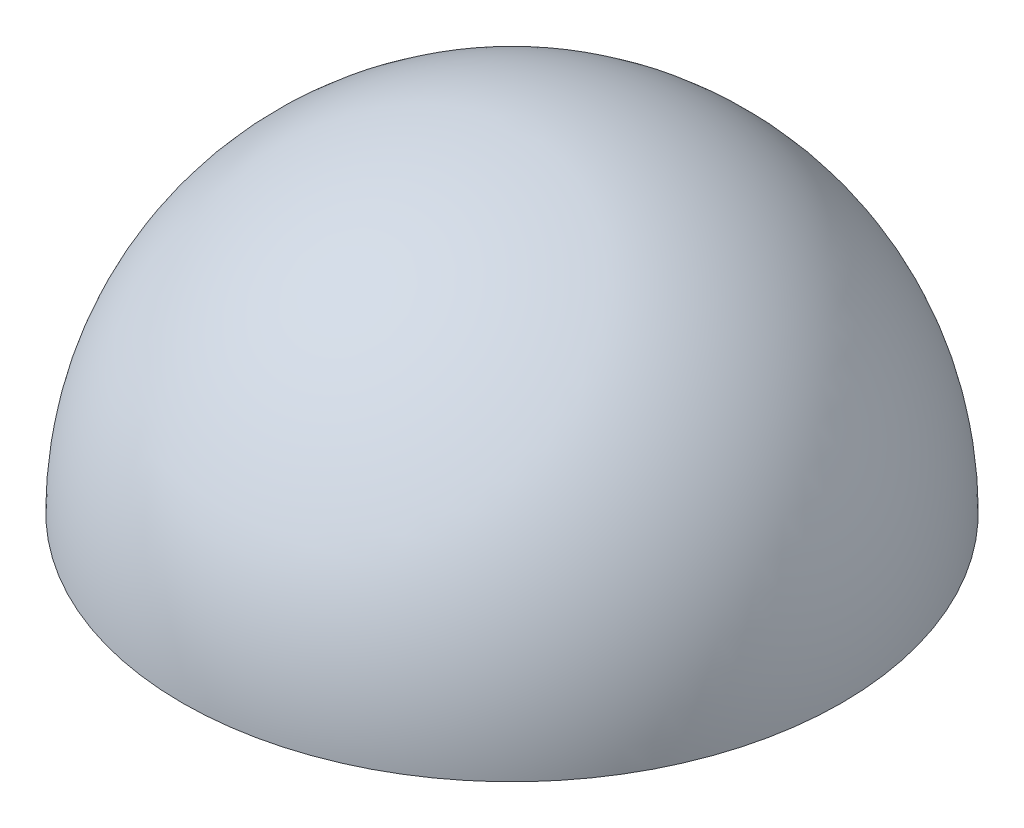
ISO-10303-21;
HEADER;
FILE_DESCRIPTION(('STEP AP214'),'2;1');
FILE_NAME('part.step','',(''),(''),'','','');
FILE_SCHEMA(('AUTOMOTIVE_DESIGN { 1 0 10303 214 1 1 1 1 }'));
ENDSEC;
DATA;
#1=APPLICATION_CONTEXT('core data for automotive mechanical design processes');
#2=APPLICATION_PROTOCOL_DEFINITION('international standard','automotive_design',2000,#1);
#3=PRODUCT_CONTEXT('',#1,'mechanical');
#4=PRODUCT('Part','Part','',(#3));
#5=PRODUCT_RELATED_PRODUCT_CATEGORY('part','',(#4));
#6=PRODUCT_DEFINITION_FORMATION('','',#4);
#7=PRODUCT_DEFINITION_CONTEXT('part definition',#1,'design');
#8=PRODUCT_DEFINITION('design','',#6,#7);
#9=PRODUCT_DEFINITION_SHAPE('','',#8);
#10=(LENGTH_UNIT() NAMED_UNIT(*) SI_UNIT(.MILLI.,.METRE.));
#11=(NAMED_UNIT(*) PLANE_ANGLE_UNIT() SI_UNIT($,.RADIAN.));
#12=(NAMED_UNIT(*) SI_UNIT($,.STERADIAN.) SOLID_ANGLE_UNIT());
#13=UNCERTAINTY_MEASURE_WITH_UNIT(LENGTH_MEASURE(1.E-05),#10,'distance_accuracy_value','');
#14=(GEOMETRIC_REPRESENTATION_CONTEXT(3) GLOBAL_UNCERTAINTY_ASSIGNED_CONTEXT((#13)) GLOBAL_UNIT_ASSIGNED_CONTEXT((#10,
#11,#12)) REPRESENTATION_CONTEXT('',''));
#15=CARTESIAN_POINT('',(0.,0.,0.));
#16=DIRECTION('',(0.,0.,1.));
#17=DIRECTION('',(1.,0.,0.));
#18=AXIS2_PLACEMENT_3D('',#15,#16,#17);
#19=CARTESIAN_POINT('',(0.,0.,0.));
#20=DIRECTION('',(0.,1.,0.));
#21=DIRECTION('',(-1.,0.,0.));
#22=AXIS2_PLACEMENT_3D('',#19,#20,#21);
#23=PLANE('',#22);
#24=CARTESIAN_POINT('',(0.,0.,0.));
#25=DIRECTION('',(0.,-1.,0.));
#26=DIRECTION('',(1.,0.,0.));
#27=AXIS2_PLACEMENT_3D('',#24,#25,#26);
#28=CIRCLE('',#27,14.4);
#29=CARTESIAN_POINT('',(14.4,0.,0.));
#30=VERTEX_POINT('',#29);
#31=EDGE_CURVE('E466',#30,#30,#28,.T.);
#32=ORIENTED_EDGE('',*,*,#31,.T.);
#33=EDGE_LOOP('',(#32));
#34=FACE_BOUND('',#33,.T.);
#35=DIRECTION('',(-1.,0.,0.));
#36=VECTOR('',#35,1.);
#37=CARTESIAN_POINT('',(1.12583302491977,0.,-9.05));
#38=LINE('',#37,#36);
#39=CARTESIAN_POINT('',(1.12583302491977,0.,-9.05));
#40=VERTEX_POINT('',#39);
#41=CARTESIAN_POINT('',(-1.12583302491977,0.,-9.05));
#42=VERTEX_POINT('',#41);
#43=EDGE_CURVE('E434',#40,#42,#38,.T.);
#44=ORIENTED_EDGE('',*,*,#43,.F.);
#45=DIRECTION('',(-0.5,0.,0.866025403784439));
#46=VECTOR('',#45,1.);
#47=CARTESIAN_POINT('',(2.25166604983954,0.,-11.));
#48=LINE('',#47,#46);
#49=CARTESIAN_POINT('',(2.25166604983954,0.,-11.));
#50=VERTEX_POINT('',#49);
#51=EDGE_CURVE('E352',#50,#40,#48,.T.);
#52=ORIENTED_EDGE('',*,*,#51,.F.);
#53=DIRECTION('',(0.5,0.,0.866025403784439));
#54=VECTOR('',#53,1.);
#55=CARTESIAN_POINT('',(1.12583302491977,0.,-12.95));
#56=LINE('',#55,#54);
#57=CARTESIAN_POINT('',(1.12583302491977,0.,-12.95));
#58=VERTEX_POINT('',#57);
#59=EDGE_CURVE('E417',#58,#50,#56,.T.);
#60=ORIENTED_EDGE('',*,*,#59,.F.);
#61=DIRECTION('',(1.,0.,0.));
#62=VECTOR('',#61,1.);
#63=CARTESIAN_POINT('',(-1.12583302491977,0.,-12.95));
#64=LINE('',#63,#62);
#65=CARTESIAN_POINT('',(-1.12583302491977,0.,-12.95));
#66=VERTEX_POINT('',#65);
#67=EDGE_CURVE('E421',#66,#58,#64,.T.);
#68=ORIENTED_EDGE('',*,*,#67,.F.);
#69=DIRECTION('',(0.5,0.,-0.866025403784438));
#70=VECTOR('',#69,1.);
#71=CARTESIAN_POINT('',(-2.25166604983954,0.,-11.));
#72=LINE('',#71,#70);
#73=CARTESIAN_POINT('',(-2.25166604983954,0.,-11.));
#74=VERTEX_POINT('',#73);
#75=EDGE_CURVE('E426',#74,#66,#72,.T.);
#76=ORIENTED_EDGE('',*,*,#75,.F.);
#77=DIRECTION('',(-0.5,0.,-0.866025403784439));
#78=VECTOR('',#77,1.);
#79=CARTESIAN_POINT('',(-1.12583302491977,0.,-9.05));
#80=LINE('',#79,#78);
#81=EDGE_CURVE('E430',#42,#74,#80,.T.);
#82=ORIENTED_EDGE('',*,*,#81,.F.);
#83=EDGE_LOOP('',(#44,#52,#60,#68,#76,#82));
#84=FACE_BOUND('',#83,.T.);
#85=DIRECTION('',(0.499999999999999,0.,-0.866025403784439));
#86=VECTOR('',#85,1.);
#87=CARTESIAN_POINT('',(7.27461339178936,0.,5.49999999999996));
#88=LINE('',#87,#86);
#89=CARTESIAN_POINT('',(7.27461339178935,0.,5.49999999999996));
#90=VERTEX_POINT('',#89);
#91=CARTESIAN_POINT('',(8.40044641670912,0.,3.54999999999996));
#92=VERTEX_POINT('',#91);
#93=EDGE_CURVE('E370',#90,#92,#88,.T.);
#94=ORIENTED_EDGE('',*,*,#93,.F.);
#95=DIRECTION('',(-0.5,0.,-0.866025403784439));
#96=VECTOR('',#95,1.);
#97=CARTESIAN_POINT('',(8.40044641670913,0.,7.44999999999996));
#98=LINE('',#97,#96);
#99=CARTESIAN_POINT('',(8.40044641670913,0.,7.44999999999996));
#100=VERTEX_POINT('',#99);
#101=EDGE_CURVE('E295',#100,#90,#98,.T.);
#102=ORIENTED_EDGE('',*,*,#101,.F.);
#103=DIRECTION('',(-1.,0.,0.));
#104=VECTOR('',#103,1.);
#105=CARTESIAN_POINT('',(10.6521124665487,0.,7.44999999999996));
#106=LINE('',#105,#104);
#107=CARTESIAN_POINT('',(10.6521124665487,0.,7.44999999999996));
#108=VERTEX_POINT('',#107);
#109=EDGE_CURVE('E353',#108,#100,#106,.T.);
#110=ORIENTED_EDGE('',*,*,#109,.F.);
#111=DIRECTION('',(-0.5,0.,0.866025403784439));
#112=VECTOR('',#111,1.);
#113=CARTESIAN_POINT('',(11.7779454914684,0.,5.49999999999996));
#114=LINE('',#113,#112);
#115=CARTESIAN_POINT('',(11.7779454914684,0.,5.49999999999996));
#116=VERTEX_POINT('',#115);
#117=EDGE_CURVE('E357',#116,#108,#114,.T.);
#118=ORIENTED_EDGE('',*,*,#117,.F.);
#119=DIRECTION('',(0.5,0.,0.866025403784439));
#120=VECTOR('',#119,1.);
#121=CARTESIAN_POINT('',(10.6521124665487,0.,3.54999999999996));
#122=LINE('',#121,#120);
#123=CARTESIAN_POINT('',(10.6521124665487,0.,3.54999999999996));
#124=VERTEX_POINT('',#123);
#125=EDGE_CURVE('E362',#124,#116,#122,.T.);
#126=ORIENTED_EDGE('',*,*,#125,.F.);
#127=DIRECTION('',(1.,0.,0.));
#128=VECTOR('',#127,1.);
#129=CARTESIAN_POINT('',(8.40044641670912,0.,3.54999999999996));
#130=LINE('',#129,#128);
#131=EDGE_CURVE('E366',#92,#124,#130,.T.);
#132=ORIENTED_EDGE('',*,*,#131,.F.);
#133=EDGE_LOOP('',(#94,#102,#110,#118,#126,#132));
#134=FACE_BOUND('',#133,.T.);
#135=DIRECTION('',(0.5,0.,0.866025403784438));
#136=VECTOR('',#135,1.);
#137=CARTESIAN_POINT('',(-8.40044641670898,0.,3.55000000000004));
#138=LINE('',#137,#136);
#139=CARTESIAN_POINT('',(-8.40044641670898,0.,3.55000000000004));
#140=VERTEX_POINT('',#139);
#141=CARTESIAN_POINT('',(-7.27461339178921,0.,5.50000000000004));
#142=VERTEX_POINT('',#141);
#143=EDGE_CURVE('E294',#140,#142,#138,.T.);
#144=ORIENTED_EDGE('',*,*,#143,.F.);
#145=DIRECTION('',(1.,0.,0.));
#146=VECTOR('',#145,1.);
#147=CARTESIAN_POINT('',(-10.6521124665485,0.,3.55000000000004));
#148=LINE('',#147,#146);
#149=CARTESIAN_POINT('',(-10.6521124665485,0.,3.55000000000004));
#150=VERTEX_POINT('',#149);
#151=EDGE_CURVE('E72',#150,#140,#148,.T.);
#152=ORIENTED_EDGE('',*,*,#151,.F.);
#153=DIRECTION('',(0.5,0.,-0.866025403784439));
#154=VECTOR('',#153,1.);
#155=CARTESIAN_POINT('',(-11.7779454914683,0.,5.50000000000004));
#156=LINE('',#155,#154);
#157=CARTESIAN_POINT('',(-11.7779454914683,0.,5.50000000000004));
#158=VERTEX_POINT('',#157);
#159=EDGE_CURVE('E271',#158,#150,#156,.T.);
#160=ORIENTED_EDGE('',*,*,#159,.F.);
#161=DIRECTION('',(-0.5,0.,-0.866025403784438));
#162=VECTOR('',#161,1.);
#163=CARTESIAN_POINT('',(-10.6521124665485,0.,7.45000000000004));
#164=LINE('',#163,#162);
#165=CARTESIAN_POINT('',(-10.6521124665485,0.,7.45000000000004));
#166=VERTEX_POINT('',#165);
#167=EDGE_CURVE('E307',#166,#158,#164,.T.);
#168=ORIENTED_EDGE('',*,*,#167,.F.);
#169=DIRECTION('',(-1.,0.,0.));
#170=VECTOR('',#169,1.);
#171=CARTESIAN_POINT('',(-8.40044641670898,0.,7.45000000000004));
#172=LINE('',#171,#170);
#173=CARTESIAN_POINT('',(-8.40044641670898,0.,7.45000000000004));
#174=VERTEX_POINT('',#173);
#175=EDGE_CURVE('E303',#174,#166,#172,.T.);
#176=ORIENTED_EDGE('',*,*,#175,.F.);
#177=DIRECTION('',(-0.5,0.,0.866025403784439));
#178=VECTOR('',#177,1.);
#179=CARTESIAN_POINT('',(-7.27461339178921,0.,5.50000000000004));
#180=LINE('',#179,#178);
#181=EDGE_CURVE('E299',#142,#174,#180,.T.);
#182=ORIENTED_EDGE('',*,*,#181,.F.);
#183=EDGE_LOOP('',(#144,#152,#160,#168,#176,#182));
#184=FACE_BOUND('',#183,.T.);
#185=DIRECTION('',(1.,0.,0.));
#186=VECTOR('',#185,1.);
#187=CARTESIAN_POINT('',(0.,0.,-8.55));
#188=LINE('',#187,#186);
#189=CARTESIAN_POINT('',(-4.9363448015713,0.,-8.55));
#190=VERTEX_POINT('',#189);
#191=CARTESIAN_POINT('',(4.9363448015713,0.,-8.55));
#192=VERTEX_POINT('',#191);
#193=EDGE_CURVE('E11',#190,#192,#188,.T.);
#194=ORIENTED_EDGE('',*,*,#193,.F.);
#195=DIRECTION('',(0.5,0.,-0.866025403784439));
#196=VECTOR('',#195,1.);
#197=CARTESIAN_POINT('',(-7.40451720235695,0.,-4.275));
#198=LINE('',#197,#196);
#199=CARTESIAN_POINT('',(-9.87268960314259,0.,0.));
#200=VERTEX_POINT('',#199);
#201=EDGE_CURVE('E509',#200,#190,#198,.T.);
#202=ORIENTED_EDGE('',*,*,#201,.F.);
#203=DIRECTION('',(-0.5,0.,-0.866025403784439));
#204=VECTOR('',#203,1.);
#205=CARTESIAN_POINT('',(-7.40451720235695,0.,4.275));
#206=LINE('',#205,#204);
#207=CARTESIAN_POINT('',(-4.9363448015713,0.,8.55));
#208=VERTEX_POINT('',#207);
#209=EDGE_CURVE('E512',#208,#200,#206,.T.);
#210=ORIENTED_EDGE('',*,*,#209,.F.);
#211=DIRECTION('',(-1.,0.,0.));
#212=VECTOR('',#211,1.);
#213=CARTESIAN_POINT('',(0.,0.,8.55));
#214=LINE('',#213,#212);
#215=CARTESIAN_POINT('',(4.93634480157129,0.,8.55));
#216=VERTEX_POINT('',#215);
#217=EDGE_CURVE('E527',#216,#208,#214,.T.);
#218=ORIENTED_EDGE('',*,*,#217,.F.);
#219=DIRECTION('',(-0.5,0.,0.866025403784439));
#220=VECTOR('',#219,1.);
#221=CARTESIAN_POINT('',(7.40451720235695,0.,4.275));
#222=LINE('',#221,#220);
#223=CARTESIAN_POINT('',(9.87268960314259,0.,0.));
#224=VERTEX_POINT('',#223);
#225=EDGE_CURVE('E530',#224,#216,#222,.T.);
#226=ORIENTED_EDGE('',*,*,#225,.F.);
#227=DIRECTION('',(0.5,0.,0.866025403784439));
#228=VECTOR('',#227,1.);
#229=CARTESIAN_POINT('',(7.40451720235695,0.,-4.27499999999999));
#230=LINE('',#229,#228);
#231=EDGE_CURVE('E57',#192,#224,#230,.T.);
#232=ORIENTED_EDGE('',*,*,#231,.F.);
#233=EDGE_LOOP('',(#194,#202,#210,#218,#226,#232));
#234=FACE_BOUND('',#233,.T.);
#235=ADVANCED_FACE('F49',(#34,#84,#134,#184,#234),#23,.F.);
#236=CARTESIAN_POINT('',(0.,0.,0.));
#237=DIRECTION('',(0.,-1.,0.));
#238=DIRECTION('',(-1.,0.,0.));
#239=AXIS2_PLACEMENT_3D('',#236,#237,#238);
#240=SPHERICAL_SURFACE('',#239,14.4);
#241=ORIENTED_EDGE('',*,*,#31,.F.);
#242=EDGE_LOOP('',(#241));
#243=FACE_BOUND('',#242,.T.);
#244=ADVANCED_FACE('F490',(#243),#240,.T.);
#245=CARTESIAN_POINT('',(0.,2.2,0.));
#246=DIRECTION('',(0.,-1.,0.));
#247=DIRECTION('',(1.,0.,0.));
#248=AXIS2_PLACEMENT_3D('',#245,#246,#247);
#249=PLANE('',#248);
#250=DIRECTION('',(1.,0.,0.));
#251=VECTOR('',#250,1.);
#252=CARTESIAN_POINT('',(-10.6521124665485,2.19999999999996,3.55000000000004));
#253=LINE('',#252,#251);
#254=CARTESIAN_POINT('',(-10.6521124665485,2.19999999999996,3.55000000000004));
#255=VERTEX_POINT('',#254);
#256=CARTESIAN_POINT('',(-8.40044641670899,2.19999999999997,3.55000000000004));
#257=VERTEX_POINT('',#256);
#258=EDGE_CURVE('E266',#255,#257,#253,.T.);
#259=ORIENTED_EDGE('',*,*,#258,.T.);
#260=DIRECTION('',(0.5,0.,0.866025403784438));
#261=VECTOR('',#260,1.);
#262=CARTESIAN_POINT('',(-8.40044641670899,2.19999999999997,3.55000000000004));
#263=LINE('',#262,#261);
#264=CARTESIAN_POINT('',(-7.27461339178922,2.19999999999997,5.50000000000004));
#265=VERTEX_POINT('',#264);
#266=EDGE_CURVE('E270',#257,#265,#263,.T.);
#267=ORIENTED_EDGE('',*,*,#266,.T.);
#268=DIRECTION('',(-0.5,0.,0.866025403784439));
#269=VECTOR('',#268,1.);
#270=CARTESIAN_POINT('',(-7.27461339178922,2.19999999999997,5.50000000000004));
#271=LINE('',#270,#269);
#272=CARTESIAN_POINT('',(-8.40044641670899,2.19999999999997,7.45000000000004));
#273=VERTEX_POINT('',#272);
#274=EDGE_CURVE('E275',#265,#273,#271,.T.);
#275=ORIENTED_EDGE('',*,*,#274,.T.);
#276=DIRECTION('',(-1.,0.,0.));
#277=VECTOR('',#276,1.);
#278=CARTESIAN_POINT('',(-8.40044641670899,2.19999999999997,7.45000000000004));
#279=LINE('',#278,#277);
#280=CARTESIAN_POINT('',(-10.6521124665485,2.19999999999996,7.45000000000004));
#281=VERTEX_POINT('',#280);
#282=EDGE_CURVE('E279',#273,#281,#279,.T.);
#283=ORIENTED_EDGE('',*,*,#282,.T.);
#284=DIRECTION('',(-0.5,0.,-0.866025403784438));
#285=VECTOR('',#284,1.);
#286=CARTESIAN_POINT('',(-10.6521124665485,2.19999999999996,7.45000000000004));
#287=LINE('',#286,#285);
#288=CARTESIAN_POINT('',(-11.7779454914683,2.19999999999996,5.50000000000004));
#289=VERTEX_POINT('',#288);
#290=EDGE_CURVE('E283',#281,#289,#287,.T.);
#291=ORIENTED_EDGE('',*,*,#290,.T.);
#292=DIRECTION('',(0.5,0.,-0.866025403784439));
#293=VECTOR('',#292,1.);
#294=CARTESIAN_POINT('',(-11.7779454914683,2.19999999999996,5.50000000000004));
#295=LINE('',#294,#293);
#296=EDGE_CURVE('E287',#289,#255,#295,.T.);
#297=ORIENTED_EDGE('',*,*,#296,.T.);
#298=EDGE_LOOP('',(#259,#267,#275,#283,#291,#297));
#299=FACE_BOUND('',#298,.T.);
#300=CARTESIAN_POINT('',(-9.52627944162876,2.19999999999997,5.50000000000004));
#301=DIRECTION('',(0.,-1.,0.));
#302=DIRECTION('',(1.,0.,0.));
#303=AXIS2_PLACEMENT_3D('',#300,#301,#302);
#304=CIRCLE('',#303,0.999999999999921);
#305=CARTESIAN_POINT('',(-8.52627944162884,2.19999999999997,5.50000000000004));
#306=VERTEX_POINT('',#305);
#307=EDGE_CURVE('E317',#306,#306,#304,.F.);
#308=ORIENTED_EDGE('',*,*,#307,.T.);
#309=EDGE_LOOP('',(#308));
#310=FACE_BOUND('',#309,.T.);
#311=ADVANCED_FACE('F492',(#299,#310),#249,.T.);
#312=CARTESIAN_POINT('',(-10.6521124665485,2.19999999999996,3.55000000000004));
#313=DIRECTION('',(0.,0.,-1.));
#314=DIRECTION('',(-1.,0.,0.));
#315=AXIS2_PLACEMENT_3D('',#312,#313,#314);
#316=PLANE('',#315);
#317=ORIENTED_EDGE('',*,*,#151,.T.);
#318=DIRECTION('',(0.,-1.,0.));
#319=VECTOR('',#318,1.);
#320=CARTESIAN_POINT('',(-8.40044641670899,2.19999999999997,3.55000000000004));
#321=LINE('',#320,#319);
#322=EDGE_CURVE('E291',#257,#140,#321,.T.);
#323=ORIENTED_EDGE('',*,*,#322,.F.);
#324=ORIENTED_EDGE('',*,*,#258,.F.);
#325=DIRECTION('',(0.,-1.,0.));
#326=VECTOR('',#325,1.);
#327=CARTESIAN_POINT('',(-10.6521124665485,2.19999999999996,3.55000000000004));
#328=LINE('',#327,#326);
#329=EDGE_CURVE('E314',#255,#150,#328,.T.);
#330=ORIENTED_EDGE('',*,*,#329,.T.);
#331=EDGE_LOOP('',(#317,#323,#324,#330));
#332=FACE_BOUND('',#331,.T.);
#333=ADVANCED_FACE('F498',(#332),#316,.F.);
#334=CARTESIAN_POINT('',(-11.7779454914683,2.19999999999996,5.50000000000004));
#335=DIRECTION('',(-0.866025403784439,0.,-0.5));
#336=DIRECTION('',(-0.5,0.,0.866025403784439));
#337=AXIS2_PLACEMENT_3D('',#334,#335,#336);
#338=PLANE('',#337);
#339=ORIENTED_EDGE('',*,*,#159,.T.);
#340=ORIENTED_EDGE('',*,*,#329,.F.);
#341=ORIENTED_EDGE('',*,*,#296,.F.);
#342=DIRECTION('',(0.,-1.,0.));
#343=VECTOR('',#342,1.);
#344=CARTESIAN_POINT('',(-11.7779454914683,2.19999999999996,5.50000000000004));
#345=LINE('',#344,#343);
#346=EDGE_CURVE('E318',#289,#158,#345,.T.);
#347=ORIENTED_EDGE('',*,*,#346,.T.);
#348=EDGE_LOOP('',(#339,#340,#341,#347));
#349=FACE_BOUND('',#348,.T.);
#350=ADVANCED_FACE('F564',(#349),#338,.F.);
#351=CARTESIAN_POINT('',(-10.6521124665485,2.19999999999996,7.45000000000004));
#352=DIRECTION('',(-0.866025403784438,0.,0.5));
#353=DIRECTION('',(0.5,0.,0.866025403784438));
#354=AXIS2_PLACEMENT_3D('',#351,#352,#353);
#355=PLANE('',#354);
#356=ORIENTED_EDGE('',*,*,#167,.T.);
#357=ORIENTED_EDGE('',*,*,#346,.F.);
#358=ORIENTED_EDGE('',*,*,#290,.F.);
#359=DIRECTION('',(0.,-1.,0.));
#360=VECTOR('',#359,1.);
#361=CARTESIAN_POINT('',(-10.6521124665485,2.19999999999996,7.45000000000004));
#362=LINE('',#361,#360);
#363=EDGE_CURVE('E321',#281,#166,#362,.T.);
#364=ORIENTED_EDGE('',*,*,#363,.T.);
#365=EDGE_LOOP('',(#356,#357,#358,#364));
#366=FACE_BOUND('',#365,.T.);
#367=ADVANCED_FACE('F567',(#366),#355,.F.);
#368=CARTESIAN_POINT('',(-8.40044641670899,2.19999999999997,7.45000000000004));
#369=DIRECTION('',(0.,0.,1.));
#370=DIRECTION('',(1.,0.,0.));
#371=AXIS2_PLACEMENT_3D('',#368,#369,#370);
#372=PLANE('',#371);
#373=ORIENTED_EDGE('',*,*,#175,.T.);
#374=ORIENTED_EDGE('',*,*,#363,.F.);
#375=ORIENTED_EDGE('',*,*,#282,.F.);
#376=DIRECTION('',(0.,-1.,0.));
#377=VECTOR('',#376,1.);
#378=CARTESIAN_POINT('',(-8.40044641670899,2.19999999999997,7.45000000000004));
#379=LINE('',#378,#377);
#380=EDGE_CURVE('E324',#273,#174,#379,.T.);
#381=ORIENTED_EDGE('',*,*,#380,.T.);
#382=EDGE_LOOP('',(#373,#374,#375,#381));
#383=FACE_BOUND('',#382,.T.);
#384=ADVANCED_FACE('F571',(#383),#372,.F.);
#385=CARTESIAN_POINT('',(-7.27461339178922,2.19999999999997,5.50000000000004));
#386=DIRECTION('',(0.866025403784439,0.,0.5));
#387=DIRECTION('',(0.5,0.,-0.866025403784439));
#388=AXIS2_PLACEMENT_3D('',#385,#386,#387);
#389=PLANE('',#388);
#390=ORIENTED_EDGE('',*,*,#181,.T.);
#391=ORIENTED_EDGE('',*,*,#380,.F.);
#392=ORIENTED_EDGE('',*,*,#274,.F.);
#393=DIRECTION('',(0.,-1.,0.));
#394=VECTOR('',#393,1.);
#395=CARTESIAN_POINT('',(-7.27461339178922,2.19999999999997,5.50000000000004));
#396=LINE('',#395,#394);
#397=EDGE_CURVE('E327',#265,#142,#396,.T.);
#398=ORIENTED_EDGE('',*,*,#397,.T.);
#399=EDGE_LOOP('',(#390,#391,#392,#398));
#400=FACE_BOUND('',#399,.T.);
#401=ADVANCED_FACE('F575',(#400),#389,.F.);
#402=CARTESIAN_POINT('',(-8.40044641670899,2.19999999999997,3.55000000000004));
#403=DIRECTION('',(0.866025403784438,0.,-0.5));
#404=DIRECTION('',(-0.5,0.,-0.866025403784438));
#405=AXIS2_PLACEMENT_3D('',#402,#403,#404);
#406=PLANE('',#405);
#407=ORIENTED_EDGE('',*,*,#143,.T.);
#408=ORIENTED_EDGE('',*,*,#397,.F.);
#409=ORIENTED_EDGE('',*,*,#266,.F.);
#410=ORIENTED_EDGE('',*,*,#322,.T.);
#411=EDGE_LOOP('',(#407,#408,#409,#410));
#412=FACE_BOUND('',#411,.T.);
#413=ADVANCED_FACE('F579',(#412),#406,.F.);
#414=CARTESIAN_POINT('',(0.,2.2,0.));
#415=DIRECTION('',(0.,-1.,0.));
#416=DIRECTION('',(1.,0.,0.));
#417=AXIS2_PLACEMENT_3D('',#414,#415,#416);
#418=PLANE('',#417);
#419=DIRECTION('',(-0.5,0.,-0.866025403784439));
#420=VECTOR('',#419,1.);
#421=CARTESIAN_POINT('',(8.40044641670912,2.20000000000003,7.44999999999996));
#422=LINE('',#421,#420);
#423=CARTESIAN_POINT('',(8.40044641670912,2.20000000000003,7.44999999999996));
#424=VERTEX_POINT('',#423);
#425=CARTESIAN_POINT('',(7.27461339178935,2.20000000000003,5.49999999999996));
#426=VERTEX_POINT('',#425);
#427=EDGE_CURVE('E358',#424,#426,#422,.T.);
#428=ORIENTED_EDGE('',*,*,#427,.T.);
#429=DIRECTION('',(0.499999999999999,0.,-0.866025403784439));
#430=VECTOR('',#429,1.);
#431=CARTESIAN_POINT('',(7.27461339178935,2.20000000000003,5.49999999999996));
#432=LINE('',#431,#430);
#433=CARTESIAN_POINT('',(8.40044641670912,2.20000000000003,3.54999999999996));
#434=VERTEX_POINT('',#433);
#435=EDGE_CURVE('E391',#426,#434,#432,.T.);
#436=ORIENTED_EDGE('',*,*,#435,.T.);
#437=DIRECTION('',(1.,0.,0.));
#438=VECTOR('',#437,1.);
#439=CARTESIAN_POINT('',(8.40044641670912,2.20000000000003,3.54999999999996));
#440=LINE('',#439,#438);
#441=CARTESIAN_POINT('',(10.6521124665487,2.20000000000004,3.54999999999996));
#442=VERTEX_POINT('',#441);
#443=EDGE_CURVE('E387',#434,#442,#440,.T.);
#444=ORIENTED_EDGE('',*,*,#443,.T.);
#445=DIRECTION('',(0.5,0.,0.866025403784439));
#446=VECTOR('',#445,1.);
#447=CARTESIAN_POINT('',(10.6521124665487,2.20000000000004,3.54999999999996));
#448=LINE('',#447,#446);
#449=CARTESIAN_POINT('',(11.7779454914684,2.20000000000004,5.49999999999996));
#450=VERTEX_POINT('',#449);
#451=EDGE_CURVE('E383',#442,#450,#448,.T.);
#452=ORIENTED_EDGE('',*,*,#451,.T.);
#453=DIRECTION('',(-0.5,0.,0.866025403784439));
#454=VECTOR('',#453,1.);
#455=CARTESIAN_POINT('',(11.7779454914684,2.20000000000004,5.49999999999996));
#456=LINE('',#455,#454);
#457=CARTESIAN_POINT('',(10.6521124665487,2.20000000000004,7.44999999999996));
#458=VERTEX_POINT('',#457);
#459=EDGE_CURVE('E379',#450,#458,#456,.T.);
#460=ORIENTED_EDGE('',*,*,#459,.T.);
#461=DIRECTION('',(-1.,0.,0.));
#462=VECTOR('',#461,1.);
#463=CARTESIAN_POINT('',(10.6521124665487,2.20000000000004,7.44999999999996));
#464=LINE('',#463,#462);
#465=EDGE_CURVE('E336',#458,#424,#464,.T.);
#466=ORIENTED_EDGE('',*,*,#465,.T.);
#467=EDGE_LOOP('',(#428,#436,#444,#452,#460,#466));
#468=FACE_BOUND('',#467,.T.);
#469=CARTESIAN_POINT('',(9.52627944162879,2.20000000000003,5.50000000000051));
#470=DIRECTION('',(0.,-1.,0.));
#471=DIRECTION('',(1.,0.,0.));
#472=AXIS2_PLACEMENT_3D('',#469,#470,#471);
#473=CIRCLE('',#472,1.);
#474=CARTESIAN_POINT('',(10.5262794416288,2.20000000000004,5.50000000000051));
#475=VERTEX_POINT('',#474);
#476=EDGE_CURVE('E518',#475,#475,#473,.F.);
#477=ORIENTED_EDGE('',*,*,#476,.T.);
#478=EDGE_LOOP('',(#477));
#479=FACE_BOUND('',#478,.T.);
#480=ADVANCED_FACE('F583',(#468,#479),#418,.T.);
#481=CARTESIAN_POINT('',(8.40044641670912,2.20000000000003,7.44999999999996));
#482=DIRECTION('',(-0.866025403784439,0.,0.5));
#483=DIRECTION('',(0.5,0.,0.866025403784439));
#484=AXIS2_PLACEMENT_3D('',#481,#482,#483);
#485=PLANE('',#484);
#486=ORIENTED_EDGE('',*,*,#101,.T.);
#487=DIRECTION('',(0.,-1.,0.));
#488=VECTOR('',#487,1.);
#489=CARTESIAN_POINT('',(7.27461339178935,2.20000000000003,5.49999999999996));
#490=LINE('',#489,#488);
#491=EDGE_CURVE('E332',#426,#90,#490,.T.);
#492=ORIENTED_EDGE('',*,*,#491,.F.);
#493=ORIENTED_EDGE('',*,*,#427,.F.);
#494=DIRECTION('',(0.,-1.,0.));
#495=VECTOR('',#494,1.);
#496=CARTESIAN_POINT('',(8.40044641670912,2.20000000000003,7.44999999999996));
#497=LINE('',#496,#495);
#498=EDGE_CURVE('E349',#424,#100,#497,.T.);
#499=ORIENTED_EDGE('',*,*,#498,.T.);
#500=EDGE_LOOP('',(#486,#492,#493,#499));
#501=FACE_BOUND('',#500,.T.);
#502=ADVANCED_FACE('F587',(#501),#485,.F.);
#503=CARTESIAN_POINT('',(10.6521124665487,2.20000000000004,7.44999999999996));
#504=DIRECTION('',(0.,0.,1.));
#505=DIRECTION('',(1.,0.,0.));
#506=AXIS2_PLACEMENT_3D('',#503,#504,#505);
#507=PLANE('',#506);
#508=ORIENTED_EDGE('',*,*,#109,.T.);
#509=ORIENTED_EDGE('',*,*,#498,.F.);
#510=ORIENTED_EDGE('',*,*,#465,.F.);
#511=DIRECTION('',(0.,-1.,0.));
#512=VECTOR('',#511,1.);
#513=CARTESIAN_POINT('',(10.6521124665487,2.20000000000004,7.44999999999996));
#514=LINE('',#513,#512);
#515=EDGE_CURVE('E346',#458,#108,#514,.T.);
#516=ORIENTED_EDGE('',*,*,#515,.T.);
#517=EDGE_LOOP('',(#508,#509,#510,#516));
#518=FACE_BOUND('',#517,.T.);
#519=ADVANCED_FACE('F590',(#518),#507,.F.);
#520=CARTESIAN_POINT('',(11.7779454914684,2.20000000000004,5.49999999999996));
#521=DIRECTION('',(0.866025403784438,0.,0.5));
#522=DIRECTION('',(0.5,0.,-0.866025403784439));
#523=AXIS2_PLACEMENT_3D('',#520,#521,#522);
#524=PLANE('',#523);
#525=ORIENTED_EDGE('',*,*,#117,.T.);
#526=ORIENTED_EDGE('',*,*,#515,.F.);
#527=ORIENTED_EDGE('',*,*,#459,.F.);
#528=DIRECTION('',(0.,-1.,0.));
#529=VECTOR('',#528,1.);
#530=CARTESIAN_POINT('',(11.7779454914684,2.20000000000004,5.49999999999996));
#531=LINE('',#530,#529);
#532=EDGE_CURVE('E343',#450,#116,#531,.T.);
#533=ORIENTED_EDGE('',*,*,#532,.T.);
#534=EDGE_LOOP('',(#525,#526,#527,#533));
#535=FACE_BOUND('',#534,.T.);
#536=ADVANCED_FACE('F604',(#535),#524,.F.);
#537=CARTESIAN_POINT('',(10.6521124665487,2.20000000000004,3.54999999999996));
#538=DIRECTION('',(0.866025403784439,0.,-0.5));
#539=DIRECTION('',(-0.5,0.,-0.866025403784439));
#540=AXIS2_PLACEMENT_3D('',#537,#538,#539);
#541=PLANE('',#540);
#542=ORIENTED_EDGE('',*,*,#125,.T.);
#543=ORIENTED_EDGE('',*,*,#532,.F.);
#544=ORIENTED_EDGE('',*,*,#451,.F.);
#545=DIRECTION('',(0.,-1.,0.));
#546=VECTOR('',#545,1.);
#547=CARTESIAN_POINT('',(10.6521124665487,2.20000000000004,3.54999999999996));
#548=LINE('',#547,#546);
#549=EDGE_CURVE('E340',#442,#124,#548,.T.);
#550=ORIENTED_EDGE('',*,*,#549,.T.);
#551=EDGE_LOOP('',(#542,#543,#544,#550));
#552=FACE_BOUND('',#551,.T.);
#553=ADVANCED_FACE('F600',(#552),#541,.F.);
#554=CARTESIAN_POINT('',(8.40044641670912,2.20000000000003,3.54999999999996));
#555=DIRECTION('',(0.,0.,-1.));
#556=DIRECTION('',(-1.,0.,0.));
#557=AXIS2_PLACEMENT_3D('',#554,#555,#556);
#558=PLANE('',#557);
#559=ORIENTED_EDGE('',*,*,#131,.T.);
#560=ORIENTED_EDGE('',*,*,#549,.F.);
#561=ORIENTED_EDGE('',*,*,#443,.F.);
#562=DIRECTION('',(0.,-1.,0.));
#563=VECTOR('',#562,1.);
#564=CARTESIAN_POINT('',(8.40044641670912,2.20000000000003,3.54999999999996));
#565=LINE('',#564,#563);
#566=EDGE_CURVE('E337',#434,#92,#565,.T.);
#567=ORIENTED_EDGE('',*,*,#566,.T.);
#568=EDGE_LOOP('',(#559,#560,#561,#567));
#569=FACE_BOUND('',#568,.T.);
#570=ADVANCED_FACE('F596',(#569),#558,.F.);
#571=CARTESIAN_POINT('',(7.27461339178935,2.20000000000003,5.49999999999996));
#572=DIRECTION('',(-0.866025403784439,0.,-0.499999999999999));
#573=DIRECTION('',(-0.499999999999999,0.,0.866025403784439));
#574=AXIS2_PLACEMENT_3D('',#571,#572,#573);
#575=PLANE('',#574);
#576=ORIENTED_EDGE('',*,*,#93,.T.);
#577=ORIENTED_EDGE('',*,*,#566,.F.);
#578=ORIENTED_EDGE('',*,*,#435,.F.);
#579=ORIENTED_EDGE('',*,*,#491,.T.);
#580=EDGE_LOOP('',(#576,#577,#578,#579));
#581=FACE_BOUND('',#580,.T.);
#582=ADVANCED_FACE('F592',(#581),#575,.F.);
#583=CARTESIAN_POINT('',(0.,2.2,0.));
#584=DIRECTION('',(0.,-1.,0.));
#585=DIRECTION('',(1.,0.,0.));
#586=AXIS2_PLACEMENT_3D('',#583,#584,#585);
#587=PLANE('',#586);
#588=DIRECTION('',(-0.5,0.,0.866025403784439));
#589=VECTOR('',#588,1.);
#590=CARTESIAN_POINT('',(2.25166604983953,2.20000000000001,-11.));
#591=LINE('',#590,#589);
#592=CARTESIAN_POINT('',(2.25166604983953,2.20000000000001,-11.));
#593=VERTEX_POINT('',#592);
#594=CARTESIAN_POINT('',(1.12583302491976,2.2,-9.05));
#595=VERTEX_POINT('',#594);
#596=EDGE_CURVE('E422',#593,#595,#591,.T.);
#597=ORIENTED_EDGE('',*,*,#596,.T.);
#598=DIRECTION('',(-1.,0.,0.));
#599=VECTOR('',#598,1.);
#600=CARTESIAN_POINT('',(1.12583302491976,2.2,-9.05));
#601=LINE('',#600,#599);
#602=CARTESIAN_POINT('',(-1.12583302491978,2.2,-9.05));
#603=VERTEX_POINT('',#602);
#604=EDGE_CURVE('E455',#595,#603,#601,.T.);
#605=ORIENTED_EDGE('',*,*,#604,.T.);
#606=DIRECTION('',(-0.5,0.,-0.866025403784439));
#607=VECTOR('',#606,1.);
#608=CARTESIAN_POINT('',(-1.12583302491978,2.2,-9.05));
#609=LINE('',#608,#607);
#610=CARTESIAN_POINT('',(-2.25166604983955,2.19999999999999,-11.));
#611=VERTEX_POINT('',#610);
#612=EDGE_CURVE('E451',#603,#611,#609,.T.);
#613=ORIENTED_EDGE('',*,*,#612,.T.);
#614=DIRECTION('',(0.5,0.,-0.866025403784438));
#615=VECTOR('',#614,1.);
#616=CARTESIAN_POINT('',(-2.25166604983955,2.19999999999999,-11.));
#617=LINE('',#616,#615);
#618=CARTESIAN_POINT('',(-1.12583302491977,2.2,-12.95));
#619=VERTEX_POINT('',#618);
#620=EDGE_CURVE('E447',#611,#619,#617,.T.);
#621=ORIENTED_EDGE('',*,*,#620,.T.);
#622=DIRECTION('',(1.,0.,0.));
#623=VECTOR('',#622,1.);
#624=CARTESIAN_POINT('',(-1.12583302491977,2.2,-12.95));
#625=LINE('',#624,#623);
#626=CARTESIAN_POINT('',(1.12583302491976,2.2,-12.95));
#627=VERTEX_POINT('',#626);
#628=EDGE_CURVE('E443',#619,#627,#625,.T.);
#629=ORIENTED_EDGE('',*,*,#628,.T.);
#630=DIRECTION('',(0.5,0.,0.866025403784439));
#631=VECTOR('',#630,1.);
#632=CARTESIAN_POINT('',(1.12583302491976,2.2,-12.95));
#633=LINE('',#632,#631);
#634=EDGE_CURVE('E402',#627,#593,#633,.T.);
#635=ORIENTED_EDGE('',*,*,#634,.T.);
#636=EDGE_LOOP('',(#597,#605,#613,#621,#629,#635));
#637=FACE_BOUND('',#636,.T.);
#638=CARTESIAN_POINT('',(4.46864458618757E-13,2.2,-10.9999999999997));
#639=DIRECTION('',(0.,-1.,0.));
#640=DIRECTION('',(1.,0.,0.));
#641=AXIS2_PLACEMENT_3D('',#638,#639,#640);
#642=CIRCLE('',#641,1.);
#643=CARTESIAN_POINT('',(1.00000000000045,2.2,-10.9999999999997));
#644=VERTEX_POINT('',#643);
#645=EDGE_CURVE('E475',#644,#644,#642,.F.);
#646=ORIENTED_EDGE('',*,*,#645,.T.);
#647=EDGE_LOOP('',(#646));
#648=FACE_BOUND('',#647,.T.);
#649=ADVANCED_FACE('F595',(#637,#648),#587,.T.);
#650=CARTESIAN_POINT('',(2.25166604983953,2.20000000000001,-11.));
#651=DIRECTION('',(0.866025403784438,0.,0.5));
#652=DIRECTION('',(0.5,0.,-0.866025403784439));
#653=AXIS2_PLACEMENT_3D('',#650,#651,#652);
#654=PLANE('',#653);
#655=ORIENTED_EDGE('',*,*,#51,.T.);
#656=DIRECTION('',(0.,-1.,0.));
#657=VECTOR('',#656,1.);
#658=CARTESIAN_POINT('',(1.12583302491976,2.2,-9.05));
#659=LINE('',#658,#657);
#660=EDGE_CURVE('E398',#595,#40,#659,.T.);
#661=ORIENTED_EDGE('',*,*,#660,.F.);
#662=ORIENTED_EDGE('',*,*,#596,.F.);
#663=DIRECTION('',(0.,-1.,0.));
#664=VECTOR('',#663,1.);
#665=CARTESIAN_POINT('',(2.25166604983953,2.20000000000001,-11.));
#666=LINE('',#665,#664);
#667=EDGE_CURVE('E223',#593,#50,#666,.T.);
#668=ORIENTED_EDGE('',*,*,#667,.T.);
#669=EDGE_LOOP('',(#655,#661,#662,#668));
#670=FACE_BOUND('',#669,.T.);
#671=ADVANCED_FACE('F615',(#670),#654,.F.);
#672=CARTESIAN_POINT('',(1.12583302491976,2.2,-12.95));
#673=DIRECTION('',(0.866025403784439,0.,-0.5));
#674=DIRECTION('',(-0.5,0.,-0.866025403784439));
#675=AXIS2_PLACEMENT_3D('',#672,#673,#674);
#676=PLANE('',#675);
#677=ORIENTED_EDGE('',*,*,#59,.T.);
#678=ORIENTED_EDGE('',*,*,#667,.F.);
#679=ORIENTED_EDGE('',*,*,#634,.F.);
#680=DIRECTION('',(0.,-1.,0.));
#681=VECTOR('',#680,1.);
#682=CARTESIAN_POINT('',(1.12583302491976,2.2,-12.95));
#683=LINE('',#682,#681);
#684=EDGE_CURVE('E412',#627,#58,#683,.T.);
#685=ORIENTED_EDGE('',*,*,#684,.T.);
#686=EDGE_LOOP('',(#677,#678,#679,#685));
#687=FACE_BOUND('',#686,.T.);
#688=ADVANCED_FACE('F618',(#687),#676,.F.);
#689=CARTESIAN_POINT('',(-1.12583302491977,2.2,-12.95));
#690=DIRECTION('',(0.,0.,-1.));
#691=DIRECTION('',(-1.,0.,0.));
#692=AXIS2_PLACEMENT_3D('',#689,#690,#691);
#693=PLANE('',#692);
#694=ORIENTED_EDGE('',*,*,#67,.T.);
#695=ORIENTED_EDGE('',*,*,#684,.F.);
#696=ORIENTED_EDGE('',*,*,#628,.F.);
#697=DIRECTION('',(0.,-1.,0.));
#698=VECTOR('',#697,1.);
#699=CARTESIAN_POINT('',(-1.12583302491977,2.2,-12.95));
#700=LINE('',#699,#698);
#701=EDGE_CURVE('E409',#619,#66,#700,.T.);
#702=ORIENTED_EDGE('',*,*,#701,.T.);
#703=EDGE_LOOP('',(#694,#695,#696,#702));
#704=FACE_BOUND('',#703,.T.);
#705=ADVANCED_FACE('F632',(#704),#693,.F.);
#706=CARTESIAN_POINT('',(-2.25166604983955,2.19999999999999,-11.));
#707=DIRECTION('',(-0.866025403784438,0.,-0.5));
#708=DIRECTION('',(-0.5,0.,0.866025403784438));
#709=AXIS2_PLACEMENT_3D('',#706,#707,#708);
#710=PLANE('',#709);
#711=ORIENTED_EDGE('',*,*,#75,.T.);
#712=ORIENTED_EDGE('',*,*,#701,.F.);
#713=ORIENTED_EDGE('',*,*,#620,.F.);
#714=DIRECTION('',(0.,-1.,0.));
#715=VECTOR('',#714,1.);
#716=CARTESIAN_POINT('',(-2.25166604983955,2.19999999999999,-11.));
#717=LINE('',#716,#715);
#718=EDGE_CURVE('E406',#611,#74,#717,.T.);
#719=ORIENTED_EDGE('',*,*,#718,.T.);
#720=EDGE_LOOP('',(#711,#712,#713,#719));
#721=FACE_BOUND('',#720,.T.);
#722=ADVANCED_FACE('F628',(#721),#710,.F.);
#723=CARTESIAN_POINT('',(-1.12583302491978,2.2,-9.05));
#724=DIRECTION('',(-0.866025403784438,0.,0.5));
#725=DIRECTION('',(0.5,0.,0.866025403784438));
#726=AXIS2_PLACEMENT_3D('',#723,#724,#725);
#727=PLANE('',#726);
#728=ORIENTED_EDGE('',*,*,#81,.T.);
#729=ORIENTED_EDGE('',*,*,#718,.F.);
#730=ORIENTED_EDGE('',*,*,#612,.F.);
#731=DIRECTION('',(0.,-1.,0.));
#732=VECTOR('',#731,1.);
#733=CARTESIAN_POINT('',(-1.12583302491978,2.2,-9.05));
#734=LINE('',#733,#732);
#735=EDGE_CURVE('E403',#603,#42,#734,.T.);
#736=ORIENTED_EDGE('',*,*,#735,.T.);
#737=EDGE_LOOP('',(#728,#729,#730,#736));
#738=FACE_BOUND('',#737,.T.);
#739=ADVANCED_FACE('F624',(#738),#727,.F.);
#740=CARTESIAN_POINT('',(1.12583302491976,2.2,-9.05));
#741=DIRECTION('',(0.,0.,1.));
#742=DIRECTION('',(1.,0.,0.));
#743=AXIS2_PLACEMENT_3D('',#740,#741,#742);
#744=PLANE('',#743);
#745=ORIENTED_EDGE('',*,*,#43,.T.);
#746=ORIENTED_EDGE('',*,*,#735,.F.);
#747=ORIENTED_EDGE('',*,*,#604,.F.);
#748=ORIENTED_EDGE('',*,*,#660,.T.);
#749=EDGE_LOOP('',(#745,#746,#747,#748));
#750=FACE_BOUND('',#749,.T.);
#751=ADVANCED_FACE('F620',(#750),#744,.F.);
#752=CARTESIAN_POINT('',(-9.52627944162878,6.99999999999997,5.50000000000004));
#753=DIRECTION('',(0.,-1.,0.));
#754=DIRECTION('',(1.,0.,0.));
#755=AXIS2_PLACEMENT_3D('',#752,#753,#754);
#756=PLANE('',#755);
#757=CARTESIAN_POINT('',(-9.52627944162878,6.99999999999997,5.50000000000004));
#758=DIRECTION('',(0.,-1.,0.));
#759=DIRECTION('',(1.,0.,0.));
#760=AXIS2_PLACEMENT_3D('',#757,#758,#759);
#761=CIRCLE('',#760,0.999999999999921);
#762=CARTESIAN_POINT('',(-8.52627944162886,6.99999999999997,5.50000000000004));
#763=VERTEX_POINT('',#762);
#764=EDGE_CURVE('E462',#763,#763,#761,.T.);
#765=ORIENTED_EDGE('',*,*,#764,.T.);
#766=EDGE_LOOP('',(#765));
#767=FACE_BOUND('',#766,.T.);
#768=ADVANCED_FACE('F623',(#767),#756,.T.);
#769=CARTESIAN_POINT('',(-9.52627944162878,6.99999999999997,5.50000000000004));
#770=DIRECTION('',(0.,-1.,0.));
#771=DIRECTION('',(1.,0.,0.));
#772=AXIS2_PLACEMENT_3D('',#769,#770,#771);
#773=CYLINDRICAL_SURFACE('',#772,0.999999999999921);
#774=ORIENTED_EDGE('',*,*,#764,.F.);
#775=EDGE_LOOP('',(#774));
#776=FACE_BOUND('',#775,.T.);
#777=ORIENTED_EDGE('',*,*,#307,.F.);
#778=EDGE_LOOP('',(#777));
#779=FACE_BOUND('',#778,.T.);
#780=ADVANCED_FACE('F645',(#776,#779),#773,.F.);
#781=CARTESIAN_POINT('',(9.52627944162878,7.00000000000003,5.50000000000051));
#782=DIRECTION('',(0.,-1.,0.));
#783=DIRECTION('',(1.,0.,0.));
#784=AXIS2_PLACEMENT_3D('',#781,#782,#783);
#785=PLANE('',#784);
#786=CARTESIAN_POINT('',(9.52627944162878,7.00000000000003,5.50000000000051));
#787=DIRECTION('',(0.,-1.,0.));
#788=DIRECTION('',(1.,0.,0.));
#789=AXIS2_PLACEMENT_3D('',#786,#787,#788);
#790=CIRCLE('',#789,1.);
#791=CARTESIAN_POINT('',(10.5262794416288,7.00000000000004,5.50000000000051));
#792=VERTEX_POINT('',#791);
#793=EDGE_CURVE('E467',#792,#792,#790,.T.);
#794=ORIENTED_EDGE('',*,*,#793,.T.);
#795=EDGE_LOOP('',(#794));
#796=FACE_BOUND('',#795,.T.);
#797=ADVANCED_FACE('F649',(#796),#785,.T.);
#798=CARTESIAN_POINT('',(9.52627944162878,7.00000000000003,5.50000000000051));
#799=DIRECTION('',(0.,-1.,0.));
#800=DIRECTION('',(1.,0.,0.));
#801=AXIS2_PLACEMENT_3D('',#798,#799,#800);
#802=CYLINDRICAL_SURFACE('',#801,1.);
#803=ORIENTED_EDGE('',*,*,#793,.F.);
#804=EDGE_LOOP('',(#803));
#805=FACE_BOUND('',#804,.T.);
#806=ORIENTED_EDGE('',*,*,#476,.F.);
#807=EDGE_LOOP('',(#806));
#808=FACE_BOUND('',#807,.T.);
#809=ADVANCED_FACE('F651',(#805,#808),#802,.F.);
#810=CARTESIAN_POINT('',(4.30399263424106E-13,7.,-10.9999999999997));
#811=DIRECTION('',(0.,-1.,0.));
#812=DIRECTION('',(1.,0.,0.));
#813=AXIS2_PLACEMENT_3D('',#810,#811,#812);
#814=PLANE('',#813);
#815=CARTESIAN_POINT('',(4.30399263424106E-13,7.,-10.9999999999997));
#816=DIRECTION('',(0.,-1.,0.));
#817=DIRECTION('',(1.,0.,0.));
#818=AXIS2_PLACEMENT_3D('',#815,#816,#817);
#819=CIRCLE('',#818,1.);
#820=CARTESIAN_POINT('',(1.00000000000043,7.,-10.9999999999997));
#821=VERTEX_POINT('',#820);
#822=EDGE_CURVE('E471',#821,#821,#819,.T.);
#823=ORIENTED_EDGE('',*,*,#822,.T.);
#824=EDGE_LOOP('',(#823));
#825=FACE_BOUND('',#824,.T.);
#826=ADVANCED_FACE('F485',(#825),#814,.T.);
#827=CARTESIAN_POINT('',(4.30399263424106E-13,7.,-10.9999999999997));
#828=DIRECTION('',(0.,-1.,0.));
#829=DIRECTION('',(1.,0.,0.));
#830=AXIS2_PLACEMENT_3D('',#827,#828,#829);
#831=CYLINDRICAL_SURFACE('',#830,1.);
#832=ORIENTED_EDGE('',*,*,#822,.F.);
#833=EDGE_LOOP('',(#832));
#834=FACE_BOUND('',#833,.T.);
#835=ORIENTED_EDGE('',*,*,#645,.F.);
#836=EDGE_LOOP('',(#835));
#837=FACE_BOUND('',#836,.T.);
#838=ADVANCED_FACE('F562',(#834,#837),#831,.F.);
#839=CARTESIAN_POINT('',(-4.93634480157127,-8.50000000000002,-8.55));
#840=DIRECTION('',(0.,0.,1.));
#841=DIRECTION('',(0.,-1.,0.));
#842=AXIS2_PLACEMENT_3D('',#839,#840,#841);
#843=PLANE('',#842);
#844=ORIENTED_EDGE('',*,*,#193,.T.);
#845=DIRECTION('',(0.,1.,0.));
#846=VECTOR('',#845,1.);
#847=CARTESIAN_POINT('',(4.93634480157133,-8.49999999999998,-8.55));
#848=LINE('',#847,#846);
#849=CARTESIAN_POINT('',(4.93634480157128,5.50000000000002,-8.55));
#850=VERTEX_POINT('',#849);
#851=EDGE_CURVE('E212',#192,#850,#848,.T.);
#852=ORIENTED_EDGE('',*,*,#851,.T.);
#853=DIRECTION('',(1.,0.,0.));
#854=VECTOR('',#853,1.);
#855=CARTESIAN_POINT('',(-4.93634480157132,5.49999999999998,-8.55));
#856=LINE('',#855,#854);
#857=CARTESIAN_POINT('',(-4.93634480157132,5.49999999999998,-8.55));
#858=VERTEX_POINT('',#857);
#859=EDGE_CURVE('E217',#858,#850,#856,.T.);
#860=ORIENTED_EDGE('',*,*,#859,.F.);
#861=DIRECTION('',(0.,1.,0.));
#862=VECTOR('',#861,1.);
#863=CARTESIAN_POINT('',(-4.93634480157127,-8.50000000000002,-8.55));
#864=LINE('',#863,#862);
#865=EDGE_CURVE('E253',#190,#858,#864,.T.);
#866=ORIENTED_EDGE('',*,*,#865,.F.);
#867=EDGE_LOOP('',(#844,#852,#860,#866));
#868=FACE_BOUND('',#867,.T.);
#869=ADVANCED_FACE('F214',(#868),#843,.T.);
#870=CARTESIAN_POINT('',(4.93634480157133,-8.49999999999998,-8.55));
#871=DIRECTION('',(-0.866025403784439,0.,0.5));
#872=DIRECTION('',(0.5,0.,0.866025403784439));
#873=AXIS2_PLACEMENT_3D('',#870,#871,#872);
#874=PLANE('',#873);
#875=ORIENTED_EDGE('',*,*,#231,.T.);
#876=DIRECTION('',(0.,1.,0.));
#877=VECTOR('',#876,1.);
#878=CARTESIAN_POINT('',(9.87268960314263,-8.49999999999997,0.));
#879=LINE('',#878,#877);
#880=CARTESIAN_POINT('',(9.87268960314258,5.50000000000003,0.));
#881=VERTEX_POINT('',#880);
#882=EDGE_CURVE('E224',#224,#881,#879,.T.);
#883=ORIENTED_EDGE('',*,*,#882,.T.);
#884=DIRECTION('',(0.499999999999999,0.,0.866025403784439));
#885=VECTOR('',#884,1.);
#886=CARTESIAN_POINT('',(4.93634480157128,5.50000000000002,-8.55));
#887=LINE('',#886,#885);
#888=EDGE_CURVE('E227',#850,#881,#887,.T.);
#889=ORIENTED_EDGE('',*,*,#888,.F.);
#890=ORIENTED_EDGE('',*,*,#851,.F.);
#891=EDGE_LOOP('',(#875,#883,#889,#890));
#892=FACE_BOUND('',#891,.T.);
#893=ADVANCED_FACE('F228',(#892),#874,.T.);
#894=CARTESIAN_POINT('',(9.87268960314263,-8.49999999999997,0.));
#895=DIRECTION('',(-0.866025403784438,0.,-0.5));
#896=DIRECTION('',(-0.5,0.,0.866025403784439));
#897=AXIS2_PLACEMENT_3D('',#894,#895,#896);
#898=PLANE('',#897);
#899=ORIENTED_EDGE('',*,*,#225,.T.);
#900=DIRECTION('',(0.,1.,0.));
#901=VECTOR('',#900,1.);
#902=CARTESIAN_POINT('',(4.93634480157132,-8.49999999999998,8.55));
#903=LINE('',#902,#901);
#904=CARTESIAN_POINT('',(4.93634480157128,5.50000000000002,8.55));
#905=VERTEX_POINT('',#904);
#906=EDGE_CURVE('E261',#216,#905,#903,.T.);
#907=ORIENTED_EDGE('',*,*,#906,.T.);
#908=DIRECTION('',(-0.5,0.,0.866025403784439));
#909=VECTOR('',#908,1.);
#910=CARTESIAN_POINT('',(9.87268960314258,5.50000000000003,0.));
#911=LINE('',#910,#909);
#912=EDGE_CURVE('E234',#881,#905,#911,.T.);
#913=ORIENTED_EDGE('',*,*,#912,.F.);
#914=ORIENTED_EDGE('',*,*,#882,.F.);
#915=EDGE_LOOP('',(#899,#907,#913,#914));
#916=FACE_BOUND('',#915,.T.);
#917=ADVANCED_FACE('F536',(#916),#898,.T.);
#918=CARTESIAN_POINT('',(4.93634480157132,-8.49999999999998,8.55));
#919=DIRECTION('',(0.,0.,-1.));
#920=DIRECTION('',(-1.,0.,0.));
#921=AXIS2_PLACEMENT_3D('',#918,#919,#920);
#922=PLANE('',#921);
#923=ORIENTED_EDGE('',*,*,#217,.T.);
#924=DIRECTION('',(0.,1.,0.));
#925=VECTOR('',#924,1.);
#926=CARTESIAN_POINT('',(-4.93634480157127,-8.50000000000002,8.55));
#927=LINE('',#926,#925);
#928=CARTESIAN_POINT('',(-4.93634480157132,5.49999999999998,8.55));
#929=VERTEX_POINT('',#928);
#930=EDGE_CURVE('E258',#208,#929,#927,.T.);
#931=ORIENTED_EDGE('',*,*,#930,.T.);
#932=DIRECTION('',(-1.,0.,0.));
#933=VECTOR('',#932,1.);
#934=CARTESIAN_POINT('',(4.93634480157128,5.50000000000002,8.55));
#935=LINE('',#934,#933);
#936=EDGE_CURVE('E244',#905,#929,#935,.T.);
#937=ORIENTED_EDGE('',*,*,#936,.F.);
#938=ORIENTED_EDGE('',*,*,#906,.F.);
#939=EDGE_LOOP('',(#923,#931,#937,#938));
#940=FACE_BOUND('',#939,.T.);
#941=ADVANCED_FACE('F543',(#940),#922,.T.);
#942=CARTESIAN_POINT('',(-4.93634480157127,-8.50000000000002,8.55));
#943=DIRECTION('',(0.866025403784439,0.,-0.5));
#944=DIRECTION('',(-0.5,0.,-0.866025403784439));
#945=AXIS2_PLACEMENT_3D('',#942,#943,#944);
#946=PLANE('',#945);
#947=ORIENTED_EDGE('',*,*,#209,.T.);
#948=DIRECTION('',(0.,1.,0.));
#949=VECTOR('',#948,1.);
#950=CARTESIAN_POINT('',(-9.87268960314257,-8.50000000000003,0.));
#951=LINE('',#950,#949);
#952=CARTESIAN_POINT('',(-9.87268960314261,5.49999999999997,0.));
#953=VERTEX_POINT('',#952);
#954=EDGE_CURVE('E64',#200,#953,#951,.T.);
#955=ORIENTED_EDGE('',*,*,#954,.T.);
#956=DIRECTION('',(-0.5,0.,-0.866025403784439));
#957=VECTOR('',#956,1.);
#958=CARTESIAN_POINT('',(-4.93634480157132,5.49999999999998,8.55));
#959=LINE('',#958,#957);
#960=EDGE_CURVE('E248',#929,#953,#959,.T.);
#961=ORIENTED_EDGE('',*,*,#960,.F.);
#962=ORIENTED_EDGE('',*,*,#930,.F.);
#963=EDGE_LOOP('',(#947,#955,#961,#962));
#964=FACE_BOUND('',#963,.T.);
#965=ADVANCED_FACE('F547',(#964),#946,.T.);
#966=CARTESIAN_POINT('',(-9.87268960314257,-8.50000000000003,0.));
#967=DIRECTION('',(0.866025403784439,0.,0.5));
#968=DIRECTION('',(0.5,0.,-0.866025403784439));
#969=AXIS2_PLACEMENT_3D('',#966,#967,#968);
#970=PLANE('',#969);
#971=ORIENTED_EDGE('',*,*,#201,.T.);
#972=ORIENTED_EDGE('',*,*,#865,.T.);
#973=DIRECTION('',(0.5,0.,-0.866025403784439));
#974=VECTOR('',#973,1.);
#975=CARTESIAN_POINT('',(-9.87268960314261,5.49999999999997,0.));
#976=LINE('',#975,#974);
#977=EDGE_CURVE('E238',#953,#858,#976,.T.);
#978=ORIENTED_EDGE('',*,*,#977,.F.);
#979=ORIENTED_EDGE('',*,*,#954,.F.);
#980=EDGE_LOOP('',(#971,#972,#978,#979));
#981=FACE_BOUND('',#980,.T.);
#982=ADVANCED_FACE('F488',(#981),#970,.T.);
#983=CARTESIAN_POINT('',(0.,5.5,0.));
#984=DIRECTION('',(0.,-1.,0.));
#985=DIRECTION('',(1.,0.,0.));
#986=AXIS2_PLACEMENT_3D('',#983,#984,#985);
#987=PLANE('',#986);
#988=CARTESIAN_POINT('',(0.,5.50000000000006,0.));
#989=DIRECTION('',(0.,-1.,0.));
#990=DIRECTION('',(1.,0.,0.));
#991=AXIS2_PLACEMENT_3D('',#988,#989,#990);
#992=CIRCLE('',#991,6.45);
#993=CARTESIAN_POINT('',(6.44999999999998,5.50000000000008,0.));
#994=VERTEX_POINT('',#993);
#995=EDGE_CURVE('E506',#994,#994,#992,.F.);
#996=ORIENTED_EDGE('',*,*,#995,.T.);
#997=EDGE_LOOP('',(#996));
#998=FACE_BOUND('',#997,.T.);
#999=ORIENTED_EDGE('',*,*,#859,.T.);
#1000=ORIENTED_EDGE('',*,*,#888,.T.);
#1001=ORIENTED_EDGE('',*,*,#912,.T.);
#1002=ORIENTED_EDGE('',*,*,#936,.T.);
#1003=ORIENTED_EDGE('',*,*,#960,.T.);
#1004=ORIENTED_EDGE('',*,*,#977,.T.);
#1005=EDGE_LOOP('',(#999,#1000,#1001,#1002,#1003,#1004));
#1006=FACE_BOUND('',#1005,.T.);
#1007=ADVANCED_FACE('F236',(#998,#1006),#987,.T.);
#1008=CARTESIAN_POINT('',(0.,5.50000000000003,0.));
#1009=DIRECTION('',(1.,0.,0.));
#1010=DIRECTION('',(0.,1.,0.));
#1011=AXIS2_PLACEMENT_3D('',#1008,#1009,#1010);
#1012=ELLIPSE('',#1011,8.,6.45);
#1013=TRIMMED_CURVE('',#1012,(PARAMETER_VALUE(0.)),(PARAMETER_VALUE(3.14159265358979)),.T.,.PARAMETER.);
#1014=CARTESIAN_POINT('',(3.43024899888577E-12,-1000.,0.));
#1015=DIRECTION('',(0.,-1.,0.));
#1016=AXIS1_PLACEMENT('',#1014,#1015);
#1017=SURFACE_OF_REVOLUTION('',#1013,#1016);
#1018=ORIENTED_EDGE('',*,*,#995,.F.);
#1019=EDGE_LOOP('',(#1018));
#1020=FACE_BOUND('',#1019,.T.);
#1021=CARTESIAN_POINT('',(0.,13.5,0.));
#1022=VERTEX_POINT('',#1021);
#1023=VERTEX_LOOP('',#1022);
#1024=FACE_BOUND('',#1023,.T.);
#1025=ADVANCED_FACE('F480',(#1020,#1024),#1017,.F.);
#1026=CLOSED_SHELL('',(#235,#244,#311,#333,#350,#367,#384,#401,#413,#480,#502,#519,#536,#553,
#570,#582,#649,#671,#688,#705,#722,#739,#751,#768,#780,#797,#809,#826,#838,#869,#893,#917,#941,
#965,#982,#1007,#1025));
#1027=MANIFOLD_SOLID_BREP('B2',#1026);
#1028=ADVANCED_BREP_SHAPE_REPRESENTATION('',(#18,#1027),#14);
#1029=SHAPE_DEFINITION_REPRESENTATION(#9,#1028);
ENDSEC;
END-ISO-10303-21;
